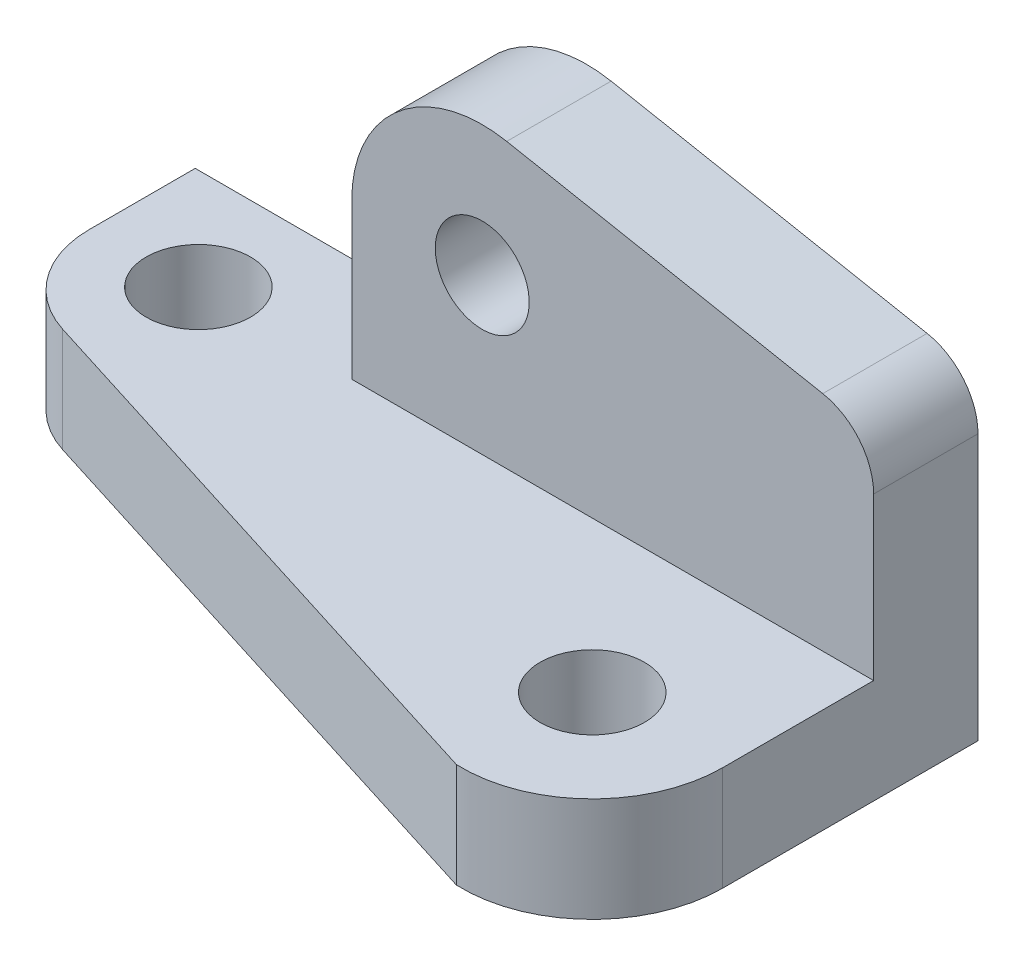
ISO-10303-21;
HEADER;
FILE_DESCRIPTION(('STEP AP214'),'2;1');
FILE_NAME('part.step','',(''),(''),'','','');
FILE_SCHEMA(('AUTOMOTIVE_DESIGN { 1 0 10303 214 1 1 1 1 }'));
ENDSEC;
DATA;
#1=APPLICATION_CONTEXT('core data for automotive mechanical design processes');
#2=APPLICATION_PROTOCOL_DEFINITION('international standard','automotive_design',2000,#1);
#3=PRODUCT_CONTEXT('',#1,'mechanical');
#4=PRODUCT('Part','Part','',(#3));
#5=PRODUCT_RELATED_PRODUCT_CATEGORY('part','',(#4));
#6=PRODUCT_DEFINITION_FORMATION('','',#4);
#7=PRODUCT_DEFINITION_CONTEXT('part definition',#1,'design');
#8=PRODUCT_DEFINITION('design','',#6,#7);
#9=PRODUCT_DEFINITION_SHAPE('','',#8);
#10=(LENGTH_UNIT() NAMED_UNIT(*) SI_UNIT(.MILLI.,.METRE.));
#11=(NAMED_UNIT(*) PLANE_ANGLE_UNIT() SI_UNIT($,.RADIAN.));
#12=(NAMED_UNIT(*) SI_UNIT($,.STERADIAN.) SOLID_ANGLE_UNIT());
#13=UNCERTAINTY_MEASURE_WITH_UNIT(LENGTH_MEASURE(1.E-05),#10,'distance_accuracy_value','');
#14=(GEOMETRIC_REPRESENTATION_CONTEXT(3) GLOBAL_UNCERTAINTY_ASSIGNED_CONTEXT((#13)) GLOBAL_UNIT_ASSIGNED_CONTEXT((#10,
#11,#12)) REPRESENTATION_CONTEXT('',''));
#15=CARTESIAN_POINT('',(0.,0.,0.));
#16=DIRECTION('',(0.,0.,1.));
#17=DIRECTION('',(1.,0.,0.));
#18=AXIS2_PLACEMENT_3D('',#15,#16,#17);
#19=CARTESIAN_POINT('',(125.,20.,48.9373729845061));
#20=DIRECTION('',(0.,-1.,0.));
#21=DIRECTION('',(0.,0.,-1.));
#22=AXIS2_PLACEMENT_3D('',#19,#20,#21);
#23=PLANE('',#22);
#24=CARTESIAN_POINT('',(20.,20.,19.3981161870684));
#25=DIRECTION('',(0.,1.,0.));
#26=DIRECTION('',(0.,0.,1.));
#27=AXIS2_PLACEMENT_3D('',#24,#25,#26);
#28=CIRCLE('',#27,10.);
#29=CARTESIAN_POINT('',(20.,20.,29.3981161870684));
#30=VERTEX_POINT('',#29);
#31=EDGE_CURVE('E160',#30,#30,#28,.T.);
#32=ORIENTED_EDGE('',*,*,#31,.F.);
#33=EDGE_LOOP('',(#32));
#34=FACE_BOUND('',#33,.T.);
#35=DIRECTION('',(0.,0.,-1.));
#36=VECTOR('',#35,1.);
#37=CARTESIAN_POINT('',(150.,20.,0.));
#38=LINE('',#37,#36);
#39=CARTESIAN_POINT('',(150.,20.,48.9373729845051));
#40=VERTEX_POINT('',#39);
#41=CARTESIAN_POINT('',(150.,20.,20.));
#42=VERTEX_POINT('',#41);
#43=EDGE_CURVE('E123',#40,#42,#38,.T.);
#44=ORIENTED_EDGE('',*,*,#43,.T.);
#45=DIRECTION('',(-1.,0.,0.));
#46=VECTOR('',#45,1.);
#47=CARTESIAN_POINT('',(50.,20.,20.));
#48=LINE('',#47,#46);
#49=CARTESIAN_POINT('',(50.,20.,20.));
#50=VERTEX_POINT('',#49);
#51=EDGE_CURVE('E146',#42,#50,#48,.T.);
#52=ORIENTED_EDGE('',*,*,#51,.T.);
#53=DIRECTION('',(0.,0.,-1.));
#54=VECTOR('',#53,1.);
#55=CARTESIAN_POINT('',(50.,20.,20.));
#56=LINE('',#55,#54);
#57=CARTESIAN_POINT('',(50.,20.,0.));
#58=VERTEX_POINT('',#57);
#59=EDGE_CURVE('E141',#50,#58,#56,.T.);
#60=ORIENTED_EDGE('',*,*,#59,.T.);
#61=DIRECTION('',(-1.,0.,0.));
#62=VECTOR('',#61,1.);
#63=CARTESIAN_POINT('',(0.,20.,0.));
#64=LINE('',#63,#62);
#65=CARTESIAN_POINT('',(0.,20.,0.));
#66=VERTEX_POINT('',#65);
#67=EDGE_CURVE('E58',#58,#66,#64,.T.);
#68=ORIENTED_EDGE('',*,*,#67,.T.);
#69=DIRECTION('',(0.,0.,1.));
#70=VECTOR('',#69,1.);
#71=CARTESIAN_POINT('',(0.,20.,20.3163447258885));
#72=LINE('',#71,#70);
#73=CARTESIAN_POINT('',(0.,20.,20.3163447258885));
#74=VERTEX_POINT('',#73);
#75=EDGE_CURVE('E166',#66,#74,#72,.T.);
#76=ORIENTED_EDGE('',*,*,#75,.T.);
#77=CARTESIAN_POINT('',(20.,20.,20.3163447258886));
#78=DIRECTION('',(0.,1.,0.));
#79=DIRECTION('',(0.,0.,-1.));
#80=AXIS2_PLACEMENT_3D('',#77,#78,#79);
#81=CIRCLE('',#80,20.);
#82=CARTESIAN_POINT('',(14.0095077077673,20.,39.3981161870684));
#83=VERTEX_POINT('',#82);
#84=EDGE_CURVE('E94',#74,#83,#81,.T.);
#85=ORIENTED_EDGE('',*,*,#84,.T.);
#86=DIRECTION('',(0.954088573058996,0.,0.299524614611636));
#87=VECTOR('',#86,1.);
#88=CARTESIAN_POINT('',(14.0095077077673,20.,39.3981161870684));
#89=LINE('',#88,#87);
#90=CARTESIAN_POINT('',(123.959936956083,20.,73.9157289925514));
#91=VERTEX_POINT('',#90);
#92=EDGE_CURVE('E101',#83,#91,#89,.T.);
#93=ORIENTED_EDGE('',*,*,#92,.T.);
#94=CARTESIAN_POINT('',(125.,20.,48.9373729845061));
#95=DIRECTION('',(0.,1.,0.));
#96=DIRECTION('',(0.,0.,-1.));
#97=AXIS2_PLACEMENT_3D('',#94,#95,#96);
#98=CIRCLE('',#97,24.9999999999995);
#99=EDGE_CURVE('E106',#91,#40,#98,.T.);
#100=ORIENTED_EDGE('',*,*,#99,.T.);
#101=EDGE_LOOP('',(#44,#52,#60,#68,#76,#85,#93,#100));
#102=FACE_BOUND('',#101,.T.);
#103=CARTESIAN_POINT('',(125.,20.,48.9157289925519));
#104=DIRECTION('',(0.,1.,0.));
#105=DIRECTION('',(0.,0.,1.));
#106=AXIS2_PLACEMENT_3D('',#103,#104,#105);
#107=CIRCLE('',#106,10.);
#108=CARTESIAN_POINT('',(125.,20.,58.9157289925519));
#109=VERTEX_POINT('',#108);
#110=EDGE_CURVE('E152',#109,#109,#107,.T.);
#111=ORIENTED_EDGE('',*,*,#110,.F.);
#112=EDGE_LOOP('',(#111));
#113=FACE_BOUND('',#112,.T.);
#114=ADVANCED_FACE('F33',(#34,#102,#113),#23,.F.);
#115=CARTESIAN_POINT('',(125.,0.,48.9373729845061));
#116=DIRECTION('',(0.,-1.,0.));
#117=DIRECTION('',(0.,0.,-1.));
#118=AXIS2_PLACEMENT_3D('',#115,#116,#117);
#119=PLANE('',#118);
#120=CARTESIAN_POINT('',(20.,0.,19.3981161870684));
#121=DIRECTION('',(0.,1.,0.));
#122=DIRECTION('',(0.,0.,1.));
#123=AXIS2_PLACEMENT_3D('',#120,#121,#122);
#124=CIRCLE('',#123,10.);
#125=CARTESIAN_POINT('',(20.,0.,29.3981161870684));
#126=VERTEX_POINT('',#125);
#127=EDGE_CURVE('E155',#126,#126,#124,.T.);
#128=ORIENTED_EDGE('',*,*,#127,.T.);
#129=EDGE_LOOP('',(#128));
#130=FACE_BOUND('',#129,.T.);
#131=DIRECTION('',(0.,0.,1.));
#132=VECTOR('',#131,1.);
#133=CARTESIAN_POINT('',(0.,0.,20.3163447258885));
#134=LINE('',#133,#132);
#135=CARTESIAN_POINT('',(0.,0.,0.));
#136=VERTEX_POINT('',#135);
#137=CARTESIAN_POINT('',(0.,0.,20.3163447258885));
#138=VERTEX_POINT('',#137);
#139=EDGE_CURVE('E163',#136,#138,#134,.T.);
#140=ORIENTED_EDGE('',*,*,#139,.F.);
#141=DIRECTION('',(-1.,0.,0.));
#142=VECTOR('',#141,1.);
#143=CARTESIAN_POINT('',(0.,0.,0.));
#144=LINE('',#143,#142);
#145=CARTESIAN_POINT('',(150.,0.,0.));
#146=VERTEX_POINT('',#145);
#147=EDGE_CURVE('E86',#146,#136,#144,.T.);
#148=ORIENTED_EDGE('',*,*,#147,.F.);
#149=DIRECTION('',(0.,0.,-1.));
#150=VECTOR('',#149,1.);
#151=CARTESIAN_POINT('',(150.,0.,0.));
#152=LINE('',#151,#150);
#153=CARTESIAN_POINT('',(150.,0.,48.9373729845051));
#154=VERTEX_POINT('',#153);
#155=EDGE_CURVE('E169',#154,#146,#152,.T.);
#156=ORIENTED_EDGE('',*,*,#155,.F.);
#157=CARTESIAN_POINT('',(125.,0.,48.9373729845061));
#158=DIRECTION('',(0.,1.,0.));
#159=DIRECTION('',(0.,0.,-1.));
#160=AXIS2_PLACEMENT_3D('',#157,#158,#159);
#161=CIRCLE('',#160,24.9999999999995);
#162=CARTESIAN_POINT('',(123.959936956083,0.,73.9157289925514));
#163=VERTEX_POINT('',#162);
#164=EDGE_CURVE('E171',#163,#154,#161,.T.);
#165=ORIENTED_EDGE('',*,*,#164,.F.);
#166=DIRECTION('',(0.954088573058996,0.,0.299524614611636));
#167=VECTOR('',#166,1.);
#168=CARTESIAN_POINT('',(14.0095077077673,0.,39.3981161870684));
#169=LINE('',#168,#167);
#170=CARTESIAN_POINT('',(14.0095077077673,0.,39.3981161870684));
#171=VERTEX_POINT('',#170);
#172=EDGE_CURVE('E115',#171,#163,#169,.T.);
#173=ORIENTED_EDGE('',*,*,#172,.F.);
#174=CARTESIAN_POINT('',(20.,0.,20.3163447258886));
#175=DIRECTION('',(0.,1.,0.));
#176=DIRECTION('',(0.,0.,-1.));
#177=AXIS2_PLACEMENT_3D('',#174,#175,#176);
#178=CIRCLE('',#177,20.);
#179=EDGE_CURVE('E182',#138,#171,#178,.T.);
#180=ORIENTED_EDGE('',*,*,#179,.F.);
#181=EDGE_LOOP('',(#140,#148,#156,#165,#173,#180));
#182=FACE_BOUND('',#181,.T.);
#183=CARTESIAN_POINT('',(125.,0.,48.9157289925519));
#184=DIRECTION('',(0.,1.,0.));
#185=DIRECTION('',(0.,0.,1.));
#186=AXIS2_PLACEMENT_3D('',#183,#184,#185);
#187=CIRCLE('',#186,10.);
#188=CARTESIAN_POINT('',(125.,0.,58.9157289925519));
#189=VERTEX_POINT('',#188);
#190=EDGE_CURVE('E156',#189,#189,#187,.T.);
#191=ORIENTED_EDGE('',*,*,#190,.T.);
#192=EDGE_LOOP('',(#191));
#193=FACE_BOUND('',#192,.T.);
#194=ADVANCED_FACE('F180',(#130,#182,#193),#119,.T.);
#195=CARTESIAN_POINT('',(0.,20.,20.3163447258885));
#196=DIRECTION('',(1.,0.,0.));
#197=DIRECTION('',(0.,0.,-1.));
#198=AXIS2_PLACEMENT_3D('',#195,#196,#197);
#199=PLANE('',#198);
#200=ORIENTED_EDGE('',*,*,#139,.T.);
#201=DIRECTION('',(0.,-1.,0.));
#202=VECTOR('',#201,1.);
#203=CARTESIAN_POINT('',(0.,20.,20.3163447258885));
#204=LINE('',#203,#202);
#205=EDGE_CURVE('E11',#74,#138,#204,.T.);
#206=ORIENTED_EDGE('',*,*,#205,.F.);
#207=ORIENTED_EDGE('',*,*,#75,.F.);
#208=DIRECTION('',(0.,-1.,0.));
#209=VECTOR('',#208,1.);
#210=CARTESIAN_POINT('',(0.,20.,0.));
#211=LINE('',#210,#209);
#212=EDGE_CURVE('E135',#66,#136,#211,.T.);
#213=ORIENTED_EDGE('',*,*,#212,.T.);
#214=EDGE_LOOP('',(#200,#206,#207,#213));
#215=FACE_BOUND('',#214,.T.);
#216=ADVANCED_FACE('F35',(#215),#199,.F.);
#217=CARTESIAN_POINT('',(20.,20.,20.3163447258886));
#218=DIRECTION('',(0.,-1.,0.));
#219=DIRECTION('',(0.,0.,-1.));
#220=AXIS2_PLACEMENT_3D('',#217,#218,#219);
#221=CYLINDRICAL_SURFACE('',#220,20.);
#222=ORIENTED_EDGE('',*,*,#179,.T.);
#223=DIRECTION('',(0.,-1.,0.));
#224=VECTOR('',#223,1.);
#225=CARTESIAN_POINT('',(14.0095077077673,20.,39.3981161870684));
#226=LINE('',#225,#224);
#227=EDGE_CURVE('E42',#83,#171,#226,.T.);
#228=ORIENTED_EDGE('',*,*,#227,.F.);
#229=ORIENTED_EDGE('',*,*,#84,.F.);
#230=ORIENTED_EDGE('',*,*,#205,.T.);
#231=EDGE_LOOP('',(#222,#228,#229,#230));
#232=FACE_BOUND('',#231,.T.);
#233=ADVANCED_FACE('F363',(#232),#221,.T.);
#234=CARTESIAN_POINT('',(14.0095077077673,20.,39.3981161870684));
#235=DIRECTION('',(0.299524614611636,0.,-0.954088573058996));
#236=DIRECTION('',(-0.954088573058996,0.,-0.299524614611636));
#237=AXIS2_PLACEMENT_3D('',#234,#235,#236);
#238=PLANE('',#237);
#239=ORIENTED_EDGE('',*,*,#172,.T.);
#240=DIRECTION('',(0.,-1.,0.));
#241=VECTOR('',#240,1.);
#242=CARTESIAN_POINT('',(123.959936956083,20.,73.9157289925514));
#243=LINE('',#242,#241);
#244=EDGE_CURVE('E112',#91,#163,#243,.T.);
#245=ORIENTED_EDGE('',*,*,#244,.F.);
#246=ORIENTED_EDGE('',*,*,#92,.F.);
#247=ORIENTED_EDGE('',*,*,#227,.T.);
#248=EDGE_LOOP('',(#239,#245,#246,#247));
#249=FACE_BOUND('',#248,.T.);
#250=ADVANCED_FACE('F113',(#249),#238,.F.);
#251=CARTESIAN_POINT('',(125.,20.,48.9373729845061));
#252=DIRECTION('',(0.,-1.,0.));
#253=DIRECTION('',(0.,0.,-1.));
#254=AXIS2_PLACEMENT_3D('',#251,#252,#253);
#255=CYLINDRICAL_SURFACE('',#254,24.9999999999995);
#256=ORIENTED_EDGE('',*,*,#164,.T.);
#257=DIRECTION('',(0.,-1.,0.));
#258=VECTOR('',#257,1.);
#259=CARTESIAN_POINT('',(150.,20.,48.9373729845051));
#260=LINE('',#259,#258);
#261=EDGE_CURVE('E118',#40,#154,#260,.T.);
#262=ORIENTED_EDGE('',*,*,#261,.F.);
#263=ORIENTED_EDGE('',*,*,#99,.F.);
#264=ORIENTED_EDGE('',*,*,#244,.T.);
#265=EDGE_LOOP('',(#256,#262,#263,#264));
#266=FACE_BOUND('',#265,.T.);
#267=ADVANCED_FACE('F120',(#266),#255,.T.);
#268=CARTESIAN_POINT('',(150.,20.,0.));
#269=DIRECTION('',(-1.,0.,0.));
#270=DIRECTION('',(0.,0.,1.));
#271=AXIS2_PLACEMENT_3D('',#268,#269,#270);
#272=PLANE('',#271);
#273=ORIENTED_EDGE('',*,*,#155,.T.);
#274=DIRECTION('',(0.,-1.,0.));
#275=VECTOR('',#274,1.);
#276=CARTESIAN_POINT('',(150.,20.,0.));
#277=LINE('',#276,#275);
#278=CARTESIAN_POINT('',(150.,50.9560938384353,0.));
#279=VERTEX_POINT('',#278);
#280=EDGE_CURVE('E176',#279,#146,#277,.T.);
#281=ORIENTED_EDGE('',*,*,#280,.F.);
#282=DIRECTION('',(0.,0.,-1.));
#283=VECTOR('',#282,1.);
#284=CARTESIAN_POINT('',(150.,50.9560938384353,20.));
#285=LINE('',#284,#283);
#286=CARTESIAN_POINT('',(150.,50.9560938384353,20.));
#287=VERTEX_POINT('',#286);
#288=EDGE_CURVE('E159',#287,#279,#285,.T.);
#289=ORIENTED_EDGE('',*,*,#288,.F.);
#290=DIRECTION('',(0.,-1.,0.));
#291=VECTOR('',#290,1.);
#292=CARTESIAN_POINT('',(150.,20.,20.));
#293=LINE('',#292,#291);
#294=EDGE_CURVE('E145',#287,#42,#293,.T.);
#295=ORIENTED_EDGE('',*,*,#294,.T.);
#296=ORIENTED_EDGE('',*,*,#43,.F.);
#297=ORIENTED_EDGE('',*,*,#261,.T.);
#298=EDGE_LOOP('',(#273,#281,#289,#295,#296,#297));
#299=FACE_BOUND('',#298,.T.);
#300=ADVANCED_FACE('F190',(#299),#272,.F.);
#301=CARTESIAN_POINT('',(0.,20.,0.));
#302=DIRECTION('',(0.,0.,1.));
#303=DIRECTION('',(1.,0.,0.));
#304=AXIS2_PLACEMENT_3D('',#301,#302,#303);
#305=PLANE('',#304);
#306=ORIENTED_EDGE('',*,*,#147,.T.);
#307=ORIENTED_EDGE('',*,*,#212,.F.);
#308=ORIENTED_EDGE('',*,*,#67,.F.);
#309=DIRECTION('',(0.,1.,0.));
#310=VECTOR('',#309,1.);
#311=CARTESIAN_POINT('',(50.,49.766827649889,0.));
#312=LINE('',#311,#310);
#313=CARTESIAN_POINT('',(50.,49.766827649889,0.));
#314=VERTEX_POINT('',#313);
#315=EDGE_CURVE('E50',#58,#314,#312,.T.);
#316=ORIENTED_EDGE('',*,*,#315,.T.);
#317=CARTESIAN_POINT('',(75.,49.766827649889,0.));
#318=DIRECTION('',(0.,0.,-1.));
#319=DIRECTION('',(-1.,0.,0.));
#320=AXIS2_PLACEMENT_3D('',#317,#318,#319);
#321=CIRCLE('',#320,25.);
#322=CARTESIAN_POINT('',(79.6951967738075,74.3219722687917,0.));
#323=VERTEX_POINT('',#322);
#324=EDGE_CURVE('E137',#314,#323,#321,.T.);
#325=ORIENTED_EDGE('',*,*,#324,.T.);
#326=DIRECTION('',(0.982205784756109,-0.1878078709523,0.));
#327=VECTOR('',#326,1.);
#328=CARTESIAN_POINT('',(140.253694451428,62.7425632555087,0.));
#329=LINE('',#328,#327);
#330=CARTESIAN_POINT('',(140.253694451428,62.7425632555087,0.));
#331=VERTEX_POINT('',#330);
#332=EDGE_CURVE('E202',#323,#331,#329,.T.);
#333=ORIENTED_EDGE('',*,*,#332,.T.);
#334=CARTESIAN_POINT('',(138.,50.9560938384354,0.));
#335=DIRECTION('',(0.,0.,-1.));
#336=DIRECTION('',(-1.,0.,0.));
#337=AXIS2_PLACEMENT_3D('',#334,#335,#336);
#338=CIRCLE('',#337,12.);
#339=EDGE_CURVE('E198',#331,#279,#338,.T.);
#340=ORIENTED_EDGE('',*,*,#339,.T.);
#341=ORIENTED_EDGE('',*,*,#280,.T.);
#342=EDGE_LOOP('',(#306,#307,#308,#316,#325,#333,#340,#341));
#343=FACE_BOUND('',#342,.T.);
#344=CARTESIAN_POINT('',(75.,49.766827649889,0.));
#345=DIRECTION('',(0.,0.,-1.));
#346=DIRECTION('',(-1.,0.,0.));
#347=AXIS2_PLACEMENT_3D('',#344,#345,#346);
#348=CIRCLE('',#347,9.);
#349=CARTESIAN_POINT('',(66.,49.766827649889,0.));
#350=VERTEX_POINT('',#349);
#351=EDGE_CURVE('E241',#350,#350,#348,.T.);
#352=ORIENTED_EDGE('',*,*,#351,.F.);
#353=EDGE_LOOP('',(#352));
#354=FACE_BOUND('',#353,.T.);
#355=ADVANCED_FACE('F194',(#343,#354),#305,.F.);
#356=CARTESIAN_POINT('',(20.,20.,19.3981161870684));
#357=DIRECTION('',(0.,-1.,0.));
#358=DIRECTION('',(0.,0.,-1.));
#359=AXIS2_PLACEMENT_3D('',#356,#357,#358);
#360=CYLINDRICAL_SURFACE('',#359,10.);
#361=ORIENTED_EDGE('',*,*,#31,.T.);
#362=EDGE_LOOP('',(#361));
#363=FACE_BOUND('',#362,.T.);
#364=ORIENTED_EDGE('',*,*,#127,.F.);
#365=EDGE_LOOP('',(#364));
#366=FACE_BOUND('',#365,.T.);
#367=ADVANCED_FACE('F256',(#363,#366),#360,.F.);
#368=CARTESIAN_POINT('',(125.,20.,48.9157289925519));
#369=DIRECTION('',(0.,-1.,0.));
#370=DIRECTION('',(0.,0.,-1.));
#371=AXIS2_PLACEMENT_3D('',#368,#369,#370);
#372=CYLINDRICAL_SURFACE('',#371,10.);
#373=ORIENTED_EDGE('',*,*,#110,.T.);
#374=EDGE_LOOP('',(#373));
#375=FACE_BOUND('',#374,.T.);
#376=ORIENTED_EDGE('',*,*,#190,.F.);
#377=EDGE_LOOP('',(#376));
#378=FACE_BOUND('',#377,.T.);
#379=ADVANCED_FACE('F262',(#375,#378),#372,.F.);
#380=CARTESIAN_POINT('',(138.,50.9560938384354,20.));
#381=DIRECTION('',(0.,0.,-1.));
#382=DIRECTION('',(-1.,0.,0.));
#383=AXIS2_PLACEMENT_3D('',#380,#381,#382);
#384=CYLINDRICAL_SURFACE('',#383,12.);
#385=ORIENTED_EDGE('',*,*,#339,.F.);
#386=DIRECTION('',(0.,0.,-1.));
#387=VECTOR('',#386,1.);
#388=CARTESIAN_POINT('',(140.253694451428,62.7425632555087,20.));
#389=LINE('',#388,#387);
#390=CARTESIAN_POINT('',(140.253694451428,62.7425632555087,20.));
#391=VERTEX_POINT('',#390);
#392=EDGE_CURVE('E213',#391,#331,#389,.T.);
#393=ORIENTED_EDGE('',*,*,#392,.F.);
#394=CARTESIAN_POINT('',(138.,50.9560938384354,20.));
#395=DIRECTION('',(0.,0.,-1.));
#396=DIRECTION('',(-1.,0.,0.));
#397=AXIS2_PLACEMENT_3D('',#394,#395,#396);
#398=CIRCLE('',#397,12.);
#399=EDGE_CURVE('E232',#391,#287,#398,.T.);
#400=ORIENTED_EDGE('',*,*,#399,.T.);
#401=ORIENTED_EDGE('',*,*,#288,.T.);
#402=EDGE_LOOP('',(#385,#393,#400,#401));
#403=FACE_BOUND('',#402,.T.);
#404=ADVANCED_FACE('F278',(#403),#384,.T.);
#405=CARTESIAN_POINT('',(140.253694451428,62.7425632555087,20.));
#406=DIRECTION('',(0.1878078709523,0.982205784756109,0.));
#407=DIRECTION('',(-0.982205784756109,0.1878078709523,0.));
#408=AXIS2_PLACEMENT_3D('',#405,#406,#407);
#409=PLANE('',#408);
#410=ORIENTED_EDGE('',*,*,#332,.F.);
#411=DIRECTION('',(0.,0.,-1.));
#412=VECTOR('',#411,1.);
#413=CARTESIAN_POINT('',(79.6951967738075,74.3219722687917,20.));
#414=LINE('',#413,#412);
#415=CARTESIAN_POINT('',(79.6951967738075,74.3219722687917,20.));
#416=VERTEX_POINT('',#415);
#417=EDGE_CURVE('E215',#416,#323,#414,.T.);
#418=ORIENTED_EDGE('',*,*,#417,.F.);
#419=DIRECTION('',(0.982205784756109,-0.1878078709523,0.));
#420=VECTOR('',#419,1.);
#421=CARTESIAN_POINT('',(140.253694451428,62.7425632555087,20.));
#422=LINE('',#421,#420);
#423=EDGE_CURVE('E235',#416,#391,#422,.T.);
#424=ORIENTED_EDGE('',*,*,#423,.T.);
#425=ORIENTED_EDGE('',*,*,#392,.T.);
#426=EDGE_LOOP('',(#410,#418,#424,#425));
#427=FACE_BOUND('',#426,.T.);
#428=ADVANCED_FACE('F284',(#427),#409,.T.);
#429=CARTESIAN_POINT('',(75.,49.766827649889,20.));
#430=DIRECTION('',(0.,0.,-1.));
#431=DIRECTION('',(-1.,0.,0.));
#432=AXIS2_PLACEMENT_3D('',#429,#430,#431);
#433=CYLINDRICAL_SURFACE('',#432,25.);
#434=ORIENTED_EDGE('',*,*,#324,.F.);
#435=DIRECTION('',(0.,0.,-1.));
#436=VECTOR('',#435,1.);
#437=CARTESIAN_POINT('',(50.,49.766827649889,20.));
#438=LINE('',#437,#436);
#439=CARTESIAN_POINT('',(50.,49.766827649889,20.));
#440=VERTEX_POINT('',#439);
#441=EDGE_CURVE('E144',#440,#314,#438,.T.);
#442=ORIENTED_EDGE('',*,*,#441,.F.);
#443=CARTESIAN_POINT('',(75.,49.766827649889,20.));
#444=DIRECTION('',(0.,0.,-1.));
#445=DIRECTION('',(-1.,0.,0.));
#446=AXIS2_PLACEMENT_3D('',#443,#444,#445);
#447=CIRCLE('',#446,25.);
#448=EDGE_CURVE('E238',#440,#416,#447,.T.);
#449=ORIENTED_EDGE('',*,*,#448,.T.);
#450=ORIENTED_EDGE('',*,*,#417,.T.);
#451=EDGE_LOOP('',(#434,#442,#449,#450));
#452=FACE_BOUND('',#451,.T.);
#453=ADVANCED_FACE('F230',(#452),#433,.T.);
#454=CARTESIAN_POINT('',(50.,49.766827649889,20.));
#455=DIRECTION('',(-1.,0.,0.));
#456=DIRECTION('',(0.,0.,1.));
#457=AXIS2_PLACEMENT_3D('',#454,#455,#456);
#458=PLANE('',#457);
#459=ORIENTED_EDGE('',*,*,#315,.F.);
#460=ORIENTED_EDGE('',*,*,#59,.F.);
#461=DIRECTION('',(0.,1.,0.));
#462=VECTOR('',#461,1.);
#463=CARTESIAN_POINT('',(50.,49.766827649889,20.));
#464=LINE('',#463,#462);
#465=EDGE_CURVE('E208',#50,#440,#464,.T.);
#466=ORIENTED_EDGE('',*,*,#465,.T.);
#467=ORIENTED_EDGE('',*,*,#441,.T.);
#468=EDGE_LOOP('',(#459,#460,#466,#467));
#469=FACE_BOUND('',#468,.T.);
#470=ADVANCED_FACE('F225',(#469),#458,.T.);
#471=CARTESIAN_POINT('',(138.,50.9560938384354,20.));
#472=DIRECTION('',(0.,0.,-1.));
#473=DIRECTION('',(-1.,0.,0.));
#474=AXIS2_PLACEMENT_3D('',#471,#472,#473);
#475=PLANE('',#474);
#476=CARTESIAN_POINT('',(75.,49.766827649889,20.));
#477=DIRECTION('',(0.,0.,-1.));
#478=DIRECTION('',(-1.,0.,0.));
#479=AXIS2_PLACEMENT_3D('',#476,#477,#478);
#480=CIRCLE('',#479,9.);
#481=CARTESIAN_POINT('',(66.,49.766827649889,20.));
#482=VERTEX_POINT('',#481);
#483=EDGE_CURVE('E138',#482,#482,#480,.T.);
#484=ORIENTED_EDGE('',*,*,#483,.T.);
#485=EDGE_LOOP('',(#484));
#486=FACE_BOUND('',#485,.T.);
#487=ORIENTED_EDGE('',*,*,#51,.F.);
#488=ORIENTED_EDGE('',*,*,#294,.F.);
#489=ORIENTED_EDGE('',*,*,#399,.F.);
#490=ORIENTED_EDGE('',*,*,#423,.F.);
#491=ORIENTED_EDGE('',*,*,#448,.F.);
#492=ORIENTED_EDGE('',*,*,#465,.F.);
#493=EDGE_LOOP('',(#487,#488,#489,#490,#491,#492));
#494=FACE_BOUND('',#493,.T.);
#495=ADVANCED_FACE('F247',(#486,#494),#475,.F.);
#496=CARTESIAN_POINT('',(75.,49.766827649889,20.));
#497=DIRECTION('',(0.,0.,-1.));
#498=DIRECTION('',(-1.,0.,0.));
#499=AXIS2_PLACEMENT_3D('',#496,#497,#498);
#500=CYLINDRICAL_SURFACE('',#499,9.);
#501=ORIENTED_EDGE('',*,*,#483,.F.);
#502=EDGE_LOOP('',(#501));
#503=FACE_BOUND('',#502,.T.);
#504=ORIENTED_EDGE('',*,*,#351,.T.);
#505=EDGE_LOOP('',(#504));
#506=FACE_BOUND('',#505,.T.);
#507=ADVANCED_FACE('F250',(#503,#506),#500,.F.);
#508=CLOSED_SHELL('',(#114,#194,#216,#233,#250,#267,#300,#355,#367,#379,#404,#428,#453,#470,
#495,#507));
#509=MANIFOLD_SOLID_BREP('B2',#508);
#510=ADVANCED_BREP_SHAPE_REPRESENTATION('',(#18,#509),#14);
#511=SHAPE_DEFINITION_REPRESENTATION(#9,#510);
ENDSEC;
END-ISO-10303-21;
